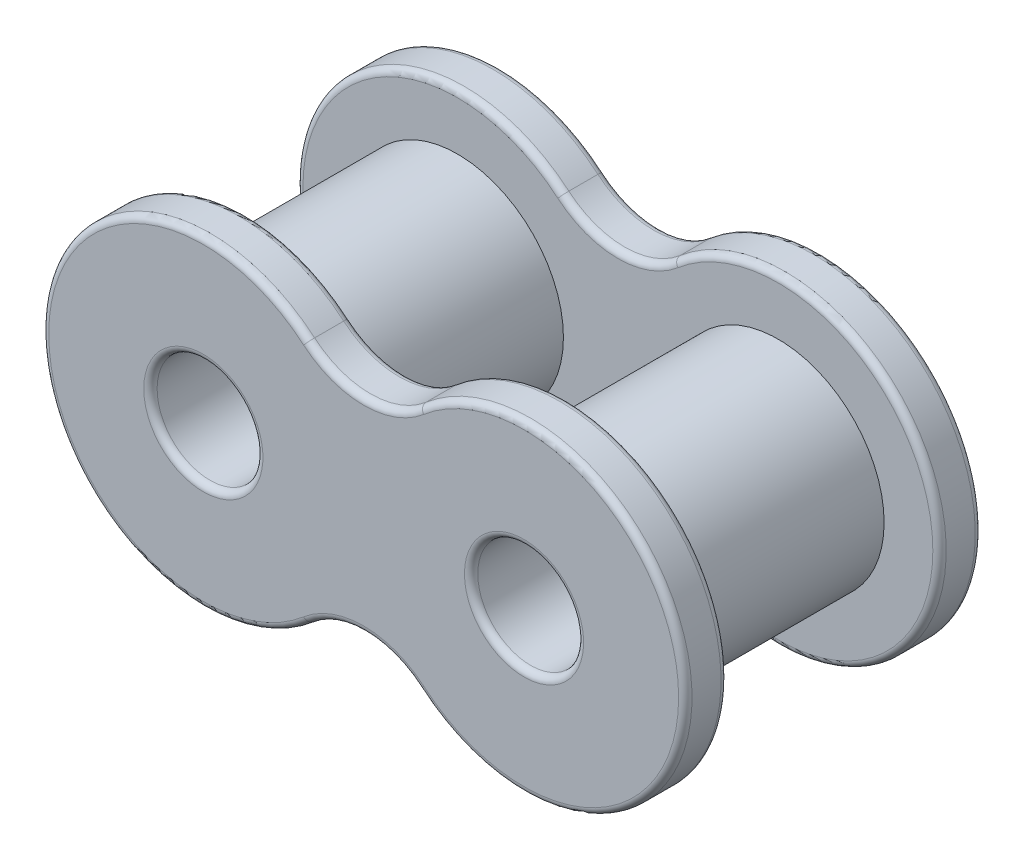
ISO-10303-21;
HEADER;
FILE_DESCRIPTION(('STEP AP214'),'2;1');
FILE_NAME('part.step','',(''),(''),'','','');
FILE_SCHEMA(('AUTOMOTIVE_DESIGN { 1 0 10303 214 1 1 1 1 }'));
ENDSEC;
DATA;
#1=APPLICATION_CONTEXT('core data for automotive mechanical design processes');
#2=APPLICATION_PROTOCOL_DEFINITION('international standard','automotive_design',2000,#1);
#3=PRODUCT_CONTEXT('',#1,'mechanical');
#4=PRODUCT('Part','Part','',(#3));
#5=PRODUCT_RELATED_PRODUCT_CATEGORY('part','',(#4));
#6=PRODUCT_DEFINITION_FORMATION('','',#4);
#7=PRODUCT_DEFINITION_CONTEXT('part definition',#1,'design');
#8=PRODUCT_DEFINITION('design','',#6,#7);
#9=PRODUCT_DEFINITION_SHAPE('','',#8);
#10=(LENGTH_UNIT() NAMED_UNIT(*) SI_UNIT(.MILLI.,.METRE.));
#11=(NAMED_UNIT(*) PLANE_ANGLE_UNIT() SI_UNIT($,.RADIAN.));
#12=(NAMED_UNIT(*) SI_UNIT($,.STERADIAN.) SOLID_ANGLE_UNIT());
#13=UNCERTAINTY_MEASURE_WITH_UNIT(LENGTH_MEASURE(1.E-05),#10,'distance_accuracy_value','');
#14=(GEOMETRIC_REPRESENTATION_CONTEXT(3) GLOBAL_UNCERTAINTY_ASSIGNED_CONTEXT((#13)) GLOBAL_UNIT_ASSIGNED_CONTEXT((#10,
#11,#12)) REPRESENTATION_CONTEXT('',''));
#15=CARTESIAN_POINT('',(0.,0.,0.));
#16=DIRECTION('',(0.,0.,1.));
#17=DIRECTION('',(1.,0.,0.));
#18=AXIS2_PLACEMENT_3D('',#15,#16,#17);
#19=CARTESIAN_POINT('',(3.,3.51943884074748,1.587));
#20=DIRECTION('',(0.,0.,1.));
#21=DIRECTION('',(1.,0.,0.));
#22=AXIS2_PLACEMENT_3D('',#19,#20,#21);
#23=PLANE('',#22);
#24=CARTESIAN_POINT('',(6.,0.,1.587));
#25=DIRECTION('',(0.,0.,1.));
#26=DIRECTION('',(1.,0.,0.));
#27=AXIS2_PLACEMENT_3D('',#24,#25,#26);
#28=CIRCLE('',#27,3.962);
#29=CARTESIAN_POINT('',(9.962,0.,1.587));
#30=VERTEX_POINT('',#29);
#31=EDGE_CURVE('E203',#30,#30,#28,.T.);
#32=ORIENTED_EDGE('',*,*,#31,.F.);
#33=EDGE_LOOP('',(#32));
#34=FACE_BOUND('',#33,.T.);
#35=CARTESIAN_POINT('',(6.,0.,1.587));
#36=DIRECTION('',(0.,0.,1.));
#37=DIRECTION('',(1.,0.,0.));
#38=AXIS2_PLACEMENT_3D('',#35,#36,#37);
#39=CIRCLE('',#38,5.785);
#40=CARTESIAN_POINT('',(2.2472012944139,-4.40258184198219,1.587));
#41=VERTEX_POINT('',#40);
#42=CARTESIAN_POINT('',(2.2472012944139,4.40258184198219,1.587));
#43=VERTEX_POINT('',#42);
#44=EDGE_CURVE('E173',#41,#43,#39,.T.);
#45=ORIENTED_EDGE('',*,*,#44,.T.);
#46=CARTESIAN_POINT('',(0.,7.03887768149496,1.587));
#47=DIRECTION('',(0.,0.,1.));
#48=DIRECTION('',(1.,0.,0.));
#49=AXIS2_PLACEMENT_3D('',#46,#47,#48);
#50=CIRCLE('',#49,3.4640972);
#51=CARTESIAN_POINT('',(-2.2472012944139,4.40258184198219,1.587));
#52=VERTEX_POINT('',#51);
#53=EDGE_CURVE('E153',#43,#52,#50,.F.);
#54=ORIENTED_EDGE('',*,*,#53,.T.);
#55=CARTESIAN_POINT('',(-6.,0.,1.587));
#56=DIRECTION('',(0.,0.,1.));
#57=DIRECTION('',(1.,0.,0.));
#58=AXIS2_PLACEMENT_3D('',#55,#56,#57);
#59=CIRCLE('',#58,5.785);
#60=CARTESIAN_POINT('',(-2.2472012944139,-4.40258184198219,1.587));
#61=VERTEX_POINT('',#60);
#62=EDGE_CURVE('E162',#52,#61,#59,.T.);
#63=ORIENTED_EDGE('',*,*,#62,.T.);
#64=CARTESIAN_POINT('',(0.,-7.03887768149496,1.587));
#65=DIRECTION('',(0.,0.,1.));
#66=DIRECTION('',(1.,0.,0.));
#67=AXIS2_PLACEMENT_3D('',#64,#65,#66);
#68=CIRCLE('',#67,3.4640972);
#69=EDGE_CURVE('E168',#61,#41,#68,.F.);
#70=ORIENTED_EDGE('',*,*,#69,.T.);
#71=EDGE_LOOP('',(#45,#54,#63,#70));
#72=FACE_BOUND('',#71,.T.);
#73=CARTESIAN_POINT('',(-6.,0.,1.587));
#74=DIRECTION('',(0.,0.,1.));
#75=DIRECTION('',(1.,0.,0.));
#76=AXIS2_PLACEMENT_3D('',#73,#74,#75);
#77=CIRCLE('',#76,3.962);
#78=CARTESIAN_POINT('',(-2.038,0.,1.587));
#79=VERTEX_POINT('',#78);
#80=EDGE_CURVE('E351',#79,#79,#77,.T.);
#81=ORIENTED_EDGE('',*,*,#80,.F.);
#82=EDGE_LOOP('',(#81));
#83=FACE_BOUND('',#82,.T.);
#84=ADVANCED_FACE('F35',(#34,#72,#83),#23,.T.);
#85=CARTESIAN_POINT('',(3.,3.51943884074748,0.));
#86=DIRECTION('',(0.,0.,1.));
#87=DIRECTION('',(1.,0.,0.));
#88=AXIS2_PLACEMENT_3D('',#85,#86,#87);
#89=PLANE('',#88);
#90=CARTESIAN_POINT('',(6.,0.,0.));
#91=DIRECTION('',(0.,0.,1.));
#92=DIRECTION('',(1.,0.,0.));
#93=AXIS2_PLACEMENT_3D('',#90,#91,#92);
#94=CIRCLE('',#93,2.23);
#95=CARTESIAN_POINT('',(8.23,0.,0.));
#96=VERTEX_POINT('',#95);
#97=EDGE_CURVE('E292',#96,#96,#94,.T.);
#98=ORIENTED_EDGE('',*,*,#97,.T.);
#99=EDGE_LOOP('',(#98));
#100=FACE_BOUND('',#99,.T.);
#101=CARTESIAN_POINT('',(-6.,0.,0.));
#102=DIRECTION('',(0.,0.,1.));
#103=DIRECTION('',(1.,0.,0.));
#104=AXIS2_PLACEMENT_3D('',#101,#102,#103);
#105=CIRCLE('',#104,2.23);
#106=CARTESIAN_POINT('',(-3.77,0.,0.));
#107=VERTEX_POINT('',#106);
#108=EDGE_CURVE('E289',#107,#107,#105,.T.);
#109=ORIENTED_EDGE('',*,*,#108,.T.);
#110=EDGE_LOOP('',(#109));
#111=FACE_BOUND('',#110,.T.);
#112=CARTESIAN_POINT('',(-6.,0.,0.));
#113=DIRECTION('',(0.,0.,1.));
#114=DIRECTION('',(1.,0.,0.));
#115=AXIS2_PLACEMENT_3D('',#112,#113,#114);
#116=CIRCLE('',#115,5.785);
#117=CARTESIAN_POINT('',(-2.2472012944139,-4.40258184198219,0.));
#118=VERTEX_POINT('',#117);
#119=CARTESIAN_POINT('',(-2.2472012944139,4.40258184198219,0.));
#120=VERTEX_POINT('',#119);
#121=EDGE_CURVE('E191',#118,#120,#116,.F.);
#122=ORIENTED_EDGE('',*,*,#121,.T.);
#123=CARTESIAN_POINT('',(0.,7.03887768149496,0.));
#124=DIRECTION('',(0.,0.,1.));
#125=DIRECTION('',(1.,0.,0.));
#126=AXIS2_PLACEMENT_3D('',#123,#124,#125);
#127=CIRCLE('',#126,3.4640972);
#128=CARTESIAN_POINT('',(2.2472012944139,4.40258184198219,0.));
#129=VERTEX_POINT('',#128);
#130=EDGE_CURVE('E197',#120,#129,#127,.T.);
#131=ORIENTED_EDGE('',*,*,#130,.T.);
#132=CARTESIAN_POINT('',(6.,0.,0.));
#133=DIRECTION('',(0.,0.,1.));
#134=DIRECTION('',(1.,0.,0.));
#135=AXIS2_PLACEMENT_3D('',#132,#133,#134);
#136=CIRCLE('',#135,5.785);
#137=CARTESIAN_POINT('',(2.2472012944139,-4.40258184198219,0.));
#138=VERTEX_POINT('',#137);
#139=EDGE_CURVE('E195',#129,#138,#136,.F.);
#140=ORIENTED_EDGE('',*,*,#139,.T.);
#141=CARTESIAN_POINT('',(0.,-7.03887768149496,0.));
#142=DIRECTION('',(0.,0.,1.));
#143=DIRECTION('',(1.,0.,0.));
#144=AXIS2_PLACEMENT_3D('',#141,#142,#143);
#145=CIRCLE('',#144,3.4640972);
#146=EDGE_CURVE('E193',#138,#118,#145,.T.);
#147=ORIENTED_EDGE('',*,*,#146,.T.);
#148=EDGE_LOOP('',(#122,#131,#140,#147));
#149=FACE_BOUND('',#148,.T.);
#150=ADVANCED_FACE('F304',(#100,#111,#149),#89,.F.);
#151=CARTESIAN_POINT('',(0.,7.03887768149496,1.587));
#152=DIRECTION('',(0.,0.,-1.));
#153=DIRECTION('',(-1.,0.,0.));
#154=AXIS2_PLACEMENT_3D('',#151,#152,#153);
#155=CYLINDRICAL_SURFACE('',#154,3.2140972);
#156=DIRECTION('',(0.,0.,-1.));
#157=VECTOR('',#156,1.);
#158=CARTESIAN_POINT('',(-2.08502330367984,4.59284034855013,1.587));
#159=LINE('',#158,#157);
#160=CARTESIAN_POINT('',(-2.08502330367984,4.59284034855013,1.337));
#161=VERTEX_POINT('',#160);
#162=CARTESIAN_POINT('',(-2.08502330367984,4.59284034855013,0.25));
#163=VERTEX_POINT('',#162);
#164=EDGE_CURVE('E169',#161,#163,#159,.T.);
#165=ORIENTED_EDGE('',*,*,#164,.F.);
#166=CARTESIAN_POINT('',(0.,7.03887768149496,1.337));
#167=DIRECTION('',(0.,0.,1.));
#168=DIRECTION('',(1.,0.,0.));
#169=AXIS2_PLACEMENT_3D('',#166,#167,#168);
#170=CIRCLE('',#169,3.2140972);
#171=CARTESIAN_POINT('',(2.08502330367985,4.59284034855014,1.337));
#172=VERTEX_POINT('',#171);
#173=EDGE_CURVE('E155',#161,#172,#170,.T.);
#174=ORIENTED_EDGE('',*,*,#173,.T.);
#175=DIRECTION('',(0.,0.,-1.));
#176=VECTOR('',#175,1.);
#177=CARTESIAN_POINT('',(2.08502330367985,4.59284034855014,1.587));
#178=LINE('',#177,#176);
#179=CARTESIAN_POINT('',(2.08502330367985,4.59284034855014,0.25));
#180=VERTEX_POINT('',#179);
#181=EDGE_CURVE('E210',#172,#180,#178,.T.);
#182=ORIENTED_EDGE('',*,*,#181,.T.);
#183=CARTESIAN_POINT('',(0.,7.03887768149496,0.25));
#184=DIRECTION('',(0.,0.,1.));
#185=DIRECTION('',(1.,0.,0.));
#186=AXIS2_PLACEMENT_3D('',#183,#184,#185);
#187=CIRCLE('',#186,3.2140972);
#188=EDGE_CURVE('E175',#180,#163,#187,.F.);
#189=ORIENTED_EDGE('',*,*,#188,.T.);
#190=EDGE_LOOP('',(#165,#174,#182,#189));
#191=FACE_BOUND('',#190,.T.);
#192=ADVANCED_FACE('F307',(#191),#155,.F.);
#193=CARTESIAN_POINT('',(-6.,0.,1.587));
#194=DIRECTION('',(0.,0.,-1.));
#195=DIRECTION('',(-1.,0.,0.));
#196=AXIS2_PLACEMENT_3D('',#193,#194,#195);
#197=CYLINDRICAL_SURFACE('',#196,6.035);
#198=DIRECTION('',(0.,0.,-1.));
#199=VECTOR('',#198,1.);
#200=CARTESIAN_POINT('',(-2.08502330367985,-4.59284034855014,1.587));
#201=LINE('',#200,#199);
#202=CARTESIAN_POINT('',(-2.08502330367985,-4.59284034855014,1.337));
#203=VERTEX_POINT('',#202);
#204=CARTESIAN_POINT('',(-2.08502330367985,-4.59284034855014,0.25));
#205=VERTEX_POINT('',#204);
#206=EDGE_CURVE('E332',#203,#205,#201,.T.);
#207=ORIENTED_EDGE('',*,*,#206,.F.);
#208=CARTESIAN_POINT('',(-6.,0.,1.337));
#209=DIRECTION('',(0.,0.,1.));
#210=DIRECTION('',(1.,0.,0.));
#211=AXIS2_PLACEMENT_3D('',#208,#209,#210);
#212=CIRCLE('',#211,6.035);
#213=EDGE_CURVE('E202',#203,#161,#212,.F.);
#214=ORIENTED_EDGE('',*,*,#213,.T.);
#215=ORIENTED_EDGE('',*,*,#164,.T.);
#216=CARTESIAN_POINT('',(-6.,0.,0.25));
#217=DIRECTION('',(0.,0.,1.));
#218=DIRECTION('',(1.,0.,0.));
#219=AXIS2_PLACEMENT_3D('',#216,#217,#218);
#220=CIRCLE('',#219,6.035);
#221=EDGE_CURVE('E200',#163,#205,#220,.T.);
#222=ORIENTED_EDGE('',*,*,#221,.T.);
#223=EDGE_LOOP('',(#207,#214,#215,#222));
#224=FACE_BOUND('',#223,.T.);
#225=ADVANCED_FACE('F331',(#224),#197,.T.);
#226=CARTESIAN_POINT('',(0.,-7.03887768149496,1.587));
#227=DIRECTION('',(0.,0.,-1.));
#228=DIRECTION('',(-1.,0.,0.));
#229=AXIS2_PLACEMENT_3D('',#226,#227,#228);
#230=CYLINDRICAL_SURFACE('',#229,3.2140972);
#231=DIRECTION('',(0.,0.,-1.));
#232=VECTOR('',#231,1.);
#233=CARTESIAN_POINT('',(2.08502330367985,-4.59284034855013,1.587));
#234=LINE('',#233,#232);
#235=CARTESIAN_POINT('',(2.08502330367985,-4.59284034855013,1.337));
#236=VERTEX_POINT('',#235);
#237=CARTESIAN_POINT('',(2.08502330367985,-4.59284034855013,0.25));
#238=VERTEX_POINT('',#237);
#239=EDGE_CURVE('E334',#236,#238,#234,.T.);
#240=ORIENTED_EDGE('',*,*,#239,.F.);
#241=CARTESIAN_POINT('',(0.,-7.03887768149496,1.337));
#242=DIRECTION('',(0.,0.,1.));
#243=DIRECTION('',(1.,0.,0.));
#244=AXIS2_PLACEMENT_3D('',#241,#242,#243);
#245=CIRCLE('',#244,3.2140972);
#246=EDGE_CURVE('E189',#236,#203,#245,.T.);
#247=ORIENTED_EDGE('',*,*,#246,.T.);
#248=ORIENTED_EDGE('',*,*,#206,.T.);
#249=CARTESIAN_POINT('',(0.,-7.03887768149496,0.25));
#250=DIRECTION('',(0.,0.,1.));
#251=DIRECTION('',(1.,0.,0.));
#252=AXIS2_PLACEMENT_3D('',#249,#250,#251);
#253=CIRCLE('',#252,3.2140972);
#254=EDGE_CURVE('E187',#205,#238,#253,.F.);
#255=ORIENTED_EDGE('',*,*,#254,.T.);
#256=EDGE_LOOP('',(#240,#247,#248,#255));
#257=FACE_BOUND('',#256,.T.);
#258=ADVANCED_FACE('F414',(#257),#230,.F.);
#259=CARTESIAN_POINT('',(6.,0.,1.587));
#260=DIRECTION('',(0.,0.,-1.));
#261=DIRECTION('',(-1.,0.,0.));
#262=AXIS2_PLACEMENT_3D('',#259,#260,#261);
#263=CYLINDRICAL_SURFACE('',#262,6.035);
#264=ORIENTED_EDGE('',*,*,#181,.F.);
#265=CARTESIAN_POINT('',(6.,0.,1.337));
#266=DIRECTION('',(0.,0.,1.));
#267=DIRECTION('',(1.,0.,0.));
#268=AXIS2_PLACEMENT_3D('',#265,#266,#267);
#269=CIRCLE('',#268,6.035);
#270=EDGE_CURVE('E185',#172,#236,#269,.F.);
#271=ORIENTED_EDGE('',*,*,#270,.T.);
#272=ORIENTED_EDGE('',*,*,#239,.T.);
#273=CARTESIAN_POINT('',(6.,0.,0.25));
#274=DIRECTION('',(0.,0.,1.));
#275=DIRECTION('',(1.,0.,0.));
#276=AXIS2_PLACEMENT_3D('',#273,#274,#275);
#277=CIRCLE('',#276,6.035);
#278=EDGE_CURVE('E183',#238,#180,#277,.T.);
#279=ORIENTED_EDGE('',*,*,#278,.T.);
#280=EDGE_LOOP('',(#264,#271,#272,#279));
#281=FACE_BOUND('',#280,.T.);
#282=ADVANCED_FACE('F347',(#281),#263,.T.);
#283=CARTESIAN_POINT('',(-6.,0.,1.587));
#284=DIRECTION('',(0.,0.,-1.));
#285=DIRECTION('',(-1.,0.,0.));
#286=AXIS2_PLACEMENT_3D('',#283,#284,#285);
#287=CYLINDRICAL_SURFACE('',#286,1.98);
#288=CARTESIAN_POINT('',(-6.,0.,10.8488));
#289=DIRECTION('',(0.,0.,-1.));
#290=DIRECTION('',(-1.,0.,0.));
#291=AXIS2_PLACEMENT_3D('',#288,#289,#290);
#292=CIRCLE('',#291,1.98);
#293=CARTESIAN_POINT('',(-7.98,0.,10.8488));
#294=VERTEX_POINT('',#293);
#295=EDGE_CURVE('E11',#294,#294,#292,.F.);
#296=ORIENTED_EDGE('',*,*,#295,.T.);
#297=EDGE_LOOP('',(#296));
#298=FACE_BOUND('',#297,.T.);
#299=CARTESIAN_POINT('',(-6.,0.,0.25));
#300=DIRECTION('',(0.,0.,1.));
#301=DIRECTION('',(1.,0.,0.));
#302=AXIS2_PLACEMENT_3D('',#299,#300,#301);
#303=CIRCLE('',#302,1.98);
#304=CARTESIAN_POINT('',(-4.02,0.,0.25));
#305=VERTEX_POINT('',#304);
#306=EDGE_CURVE('E43',#305,#305,#303,.F.);
#307=ORIENTED_EDGE('',*,*,#306,.T.);
#308=EDGE_LOOP('',(#307));
#309=FACE_BOUND('',#308,.T.);
#310=ADVANCED_FACE('F297',(#298,#309),#287,.F.);
#311=CARTESIAN_POINT('',(6.,0.,1.587));
#312=DIRECTION('',(0.,0.,-1.));
#313=DIRECTION('',(-1.,0.,0.));
#314=AXIS2_PLACEMENT_3D('',#311,#312,#313);
#315=CYLINDRICAL_SURFACE('',#314,1.98);
#316=CARTESIAN_POINT('',(6.,0.,10.8488));
#317=DIRECTION('',(0.,0.,-1.));
#318=DIRECTION('',(-1.,0.,0.));
#319=AXIS2_PLACEMENT_3D('',#316,#317,#318);
#320=CIRCLE('',#319,1.98);
#321=CARTESIAN_POINT('',(4.02,0.,10.8488));
#322=VERTEX_POINT('',#321);
#323=EDGE_CURVE('E280',#322,#322,#320,.F.);
#324=ORIENTED_EDGE('',*,*,#323,.T.);
#325=EDGE_LOOP('',(#324));
#326=FACE_BOUND('',#325,.T.);
#327=CARTESIAN_POINT('',(6.,0.,0.25));
#328=DIRECTION('',(0.,0.,1.));
#329=DIRECTION('',(1.,0.,0.));
#330=AXIS2_PLACEMENT_3D('',#327,#328,#329);
#331=CIRCLE('',#330,1.98);
#332=CARTESIAN_POINT('',(7.98,0.,0.25));
#333=VERTEX_POINT('',#332);
#334=EDGE_CURVE('E256',#333,#333,#331,.F.);
#335=ORIENTED_EDGE('',*,*,#334,.T.);
#336=EDGE_LOOP('',(#335));
#337=FACE_BOUND('',#336,.T.);
#338=ADVANCED_FACE('F431',(#326,#337),#315,.F.);
#339=CARTESIAN_POINT('',(0.,-7.03887768149496,1.337));
#340=DIRECTION('',(0.,0.,1.));
#341=DIRECTION('',(1.,0.,0.));
#342=AXIS2_PLACEMENT_3D('',#339,#340,#341);
#343=TOROIDAL_SURFACE('',#342,3.4640972,0.25);
#344=CARTESIAN_POINT('',(-2.2472012944139,-4.40258184198219,1.337));
#345=DIRECTION('',(-0.76103402627177,-0.648711962936232,0.));
#346=DIRECTION('',(0.648711962936232,-0.76103402627177,0.));
#347=AXIS2_PLACEMENT_3D('',#344,#345,#346);
#348=CIRCLE('',#347,0.25);
#349=EDGE_CURVE('E165',#203,#61,#348,.T.);
#350=ORIENTED_EDGE('',*,*,#349,.F.);
#351=ORIENTED_EDGE('',*,*,#246,.F.);
#352=CARTESIAN_POINT('',(2.2472012944139,-4.40258184198219,1.337));
#353=DIRECTION('',(0.76103402627177,-0.648711962936232,0.));
#354=DIRECTION('',(0.648711962936232,0.76103402627177,0.));
#355=AXIS2_PLACEMENT_3D('',#352,#353,#354);
#356=CIRCLE('',#355,0.25);
#357=EDGE_CURVE('E207',#41,#236,#356,.T.);
#358=ORIENTED_EDGE('',*,*,#357,.F.);
#359=ORIENTED_EDGE('',*,*,#69,.F.);
#360=EDGE_LOOP('',(#350,#351,#358,#359));
#361=FACE_BOUND('',#360,.T.);
#362=ADVANCED_FACE('F340',(#361),#343,.T.);
#363=CARTESIAN_POINT('',(6.,0.,1.337));
#364=DIRECTION('',(0.,0.,1.));
#365=DIRECTION('',(1.,0.,0.));
#366=AXIS2_PLACEMENT_3D('',#363,#364,#365);
#367=TOROIDAL_SURFACE('',#366,5.785,0.25);
#368=ORIENTED_EDGE('',*,*,#357,.T.);
#369=ORIENTED_EDGE('',*,*,#270,.F.);
#370=CARTESIAN_POINT('',(2.2472012944139,4.40258184198219,1.337));
#371=DIRECTION('',(-0.76103402627177,-0.648711962936232,0.));
#372=DIRECTION('',(0.648711962936232,-0.76103402627177,0.));
#373=AXIS2_PLACEMENT_3D('',#370,#371,#372);
#374=CIRCLE('',#373,0.25);
#375=EDGE_CURVE('E158',#43,#172,#374,.T.);
#376=ORIENTED_EDGE('',*,*,#375,.F.);
#377=ORIENTED_EDGE('',*,*,#44,.F.);
#378=EDGE_LOOP('',(#368,#369,#376,#377));
#379=FACE_BOUND('',#378,.T.);
#380=ADVANCED_FACE('F343',(#379),#367,.T.);
#381=CARTESIAN_POINT('',(-6.,0.,1.337));
#382=DIRECTION('',(0.,0.,1.));
#383=DIRECTION('',(1.,0.,0.));
#384=AXIS2_PLACEMENT_3D('',#381,#382,#383);
#385=TOROIDAL_SURFACE('',#384,5.785,0.25);
#386=ORIENTED_EDGE('',*,*,#349,.T.);
#387=ORIENTED_EDGE('',*,*,#62,.F.);
#388=CARTESIAN_POINT('',(-2.2472012944139,4.40258184198219,1.337));
#389=DIRECTION('',(0.761034026271771,-0.648711962936231,0.));
#390=DIRECTION('',(0.648711962936231,0.761034026271771,0.));
#391=AXIS2_PLACEMENT_3D('',#388,#389,#390);
#392=CIRCLE('',#391,0.25);
#393=EDGE_CURVE('E149',#161,#52,#392,.T.);
#394=ORIENTED_EDGE('',*,*,#393,.F.);
#395=ORIENTED_EDGE('',*,*,#213,.F.);
#396=EDGE_LOOP('',(#386,#387,#394,#395));
#397=FACE_BOUND('',#396,.T.);
#398=ADVANCED_FACE('F163',(#397),#385,.T.);
#399=CARTESIAN_POINT('',(0.,7.03887768149496,1.337));
#400=DIRECTION('',(0.,0.,1.));
#401=DIRECTION('',(1.,0.,0.));
#402=AXIS2_PLACEMENT_3D('',#399,#400,#401);
#403=TOROIDAL_SURFACE('',#402,3.4640972,0.25);
#404=ORIENTED_EDGE('',*,*,#375,.T.);
#405=ORIENTED_EDGE('',*,*,#173,.F.);
#406=ORIENTED_EDGE('',*,*,#393,.T.);
#407=ORIENTED_EDGE('',*,*,#53,.F.);
#408=EDGE_LOOP('',(#404,#405,#406,#407));
#409=FACE_BOUND('',#408,.T.);
#410=ADVANCED_FACE('F151',(#409),#403,.T.);
#411=CARTESIAN_POINT('',(0.,-7.03887768149496,0.25));
#412=DIRECTION('',(0.,0.,1.));
#413=DIRECTION('',(1.,0.,0.));
#414=AXIS2_PLACEMENT_3D('',#411,#412,#413);
#415=TOROIDAL_SURFACE('',#414,3.4640972,0.25);
#416=CARTESIAN_POINT('',(-2.2472012944139,-4.40258184198219,0.25));
#417=DIRECTION('',(-0.761034026271769,-0.648711962936233,0.));
#418=DIRECTION('',(0.648711962936233,-0.761034026271769,0.));
#419=AXIS2_PLACEMENT_3D('',#416,#417,#418);
#420=CIRCLE('',#419,0.25);
#421=EDGE_CURVE('E216',#118,#205,#420,.T.);
#422=ORIENTED_EDGE('',*,*,#421,.F.);
#423=ORIENTED_EDGE('',*,*,#146,.F.);
#424=CARTESIAN_POINT('',(2.2472012944139,-4.40258184198219,0.25));
#425=DIRECTION('',(0.761034026271771,-0.648711962936231,0.));
#426=DIRECTION('',(0.648711962936231,0.761034026271771,0.));
#427=AXIS2_PLACEMENT_3D('',#424,#425,#426);
#428=CIRCLE('',#427,0.25);
#429=EDGE_CURVE('E159',#238,#138,#428,.T.);
#430=ORIENTED_EDGE('',*,*,#429,.F.);
#431=ORIENTED_EDGE('',*,*,#254,.F.);
#432=EDGE_LOOP('',(#422,#423,#430,#431));
#433=FACE_BOUND('',#432,.T.);
#434=ADVANCED_FACE('F424',(#433),#415,.T.);
#435=CARTESIAN_POINT('',(6.,0.,0.25));
#436=DIRECTION('',(0.,0.,1.));
#437=DIRECTION('',(1.,0.,0.));
#438=AXIS2_PLACEMENT_3D('',#435,#436,#437);
#439=TOROIDAL_SURFACE('',#438,5.785,0.25);
#440=ORIENTED_EDGE('',*,*,#429,.T.);
#441=ORIENTED_EDGE('',*,*,#139,.F.);
#442=CARTESIAN_POINT('',(2.2472012944139,4.40258184198219,0.25));
#443=DIRECTION('',(-0.761034026271771,-0.648711962936231,0.));
#444=DIRECTION('',(0.648711962936231,-0.761034026271771,0.));
#445=AXIS2_PLACEMENT_3D('',#442,#443,#444);
#446=CIRCLE('',#445,0.25);
#447=EDGE_CURVE('E213',#180,#129,#446,.T.);
#448=ORIENTED_EDGE('',*,*,#447,.F.);
#449=ORIENTED_EDGE('',*,*,#278,.F.);
#450=EDGE_LOOP('',(#440,#441,#448,#449));
#451=FACE_BOUND('',#450,.T.);
#452=ADVANCED_FACE('F437',(#451),#439,.T.);
#453=CARTESIAN_POINT('',(-6.,0.,0.25));
#454=DIRECTION('',(0.,0.,1.));
#455=DIRECTION('',(1.,0.,0.));
#456=AXIS2_PLACEMENT_3D('',#453,#454,#455);
#457=TOROIDAL_SURFACE('',#456,5.785,0.25);
#458=ORIENTED_EDGE('',*,*,#421,.T.);
#459=ORIENTED_EDGE('',*,*,#221,.F.);
#460=CARTESIAN_POINT('',(-2.2472012944139,4.40258184198219,0.25));
#461=DIRECTION('',(0.761034026271771,-0.648711962936231,0.));
#462=DIRECTION('',(0.648711962936231,0.761034026271771,0.));
#463=AXIS2_PLACEMENT_3D('',#460,#461,#462);
#464=CIRCLE('',#463,0.25);
#465=EDGE_CURVE('E211',#120,#163,#464,.T.);
#466=ORIENTED_EDGE('',*,*,#465,.F.);
#467=ORIENTED_EDGE('',*,*,#121,.F.);
#468=EDGE_LOOP('',(#458,#459,#466,#467));
#469=FACE_BOUND('',#468,.T.);
#470=ADVANCED_FACE('F322',(#469),#457,.T.);
#471=CARTESIAN_POINT('',(0.,7.03887768149496,0.25));
#472=DIRECTION('',(0.,0.,1.));
#473=DIRECTION('',(1.,0.,0.));
#474=AXIS2_PLACEMENT_3D('',#471,#472,#473);
#475=TOROIDAL_SURFACE('',#474,3.4640972,0.25);
#476=ORIENTED_EDGE('',*,*,#447,.T.);
#477=ORIENTED_EDGE('',*,*,#130,.F.);
#478=ORIENTED_EDGE('',*,*,#465,.T.);
#479=ORIENTED_EDGE('',*,*,#188,.F.);
#480=EDGE_LOOP('',(#476,#477,#478,#479));
#481=FACE_BOUND('',#480,.T.);
#482=ADVANCED_FACE('F317',(#481),#475,.T.);
#483=CARTESIAN_POINT('',(-6.,0.,9.5118));
#484=DIRECTION('',(0.,0.,-1.));
#485=DIRECTION('',(-1.,0.,0.));
#486=AXIS2_PLACEMENT_3D('',#483,#484,#485);
#487=CYLINDRICAL_SURFACE('',#486,3.962);
#488=CARTESIAN_POINT('',(-6.,0.,9.5118));
#489=DIRECTION('',(0.,0.,1.));
#490=DIRECTION('',(1.,0.,0.));
#491=AXIS2_PLACEMENT_3D('',#488,#489,#490);
#492=CIRCLE('',#491,3.962);
#493=CARTESIAN_POINT('',(-2.038,0.,9.5118));
#494=VERTEX_POINT('',#493);
#495=EDGE_CURVE('E214',#494,#494,#492,.T.);
#496=ORIENTED_EDGE('',*,*,#495,.F.);
#497=EDGE_LOOP('',(#496));
#498=FACE_BOUND('',#497,.T.);
#499=ORIENTED_EDGE('',*,*,#80,.T.);
#500=EDGE_LOOP('',(#499));
#501=FACE_BOUND('',#500,.T.);
#502=ADVANCED_FACE('F434',(#498,#501),#487,.T.);
#503=CARTESIAN_POINT('',(6.,0.,9.5118));
#504=DIRECTION('',(0.,0.,-1.));
#505=DIRECTION('',(-1.,0.,0.));
#506=AXIS2_PLACEMENT_3D('',#503,#504,#505);
#507=CYLINDRICAL_SURFACE('',#506,3.962);
#508=CARTESIAN_POINT('',(6.,0.,9.5118));
#509=DIRECTION('',(0.,0.,-1.));
#510=DIRECTION('',(-1.,0.,0.));
#511=AXIS2_PLACEMENT_3D('',#508,#509,#510);
#512=CIRCLE('',#511,3.962);
#513=CARTESIAN_POINT('',(2.038,0.,9.5118));
#514=VERTEX_POINT('',#513);
#515=EDGE_CURVE('E354',#514,#514,#512,.T.);
#516=ORIENTED_EDGE('',*,*,#515,.T.);
#517=EDGE_LOOP('',(#516));
#518=FACE_BOUND('',#517,.T.);
#519=ORIENTED_EDGE('',*,*,#31,.T.);
#520=EDGE_LOOP('',(#519));
#521=FACE_BOUND('',#520,.T.);
#522=ADVANCED_FACE('F493',(#518,#521),#507,.T.);
#523=CARTESIAN_POINT('',(3.,3.51943884074748,9.5118));
#524=DIRECTION('',(0.,0.,-1.));
#525=DIRECTION('',(1.,0.,0.));
#526=AXIS2_PLACEMENT_3D('',#523,#524,#525);
#527=PLANE('',#526);
#528=CARTESIAN_POINT('',(-6.,0.,9.5118));
#529=DIRECTION('',(0.,0.,-1.));
#530=DIRECTION('',(-1.,0.,0.));
#531=AXIS2_PLACEMENT_3D('',#528,#529,#530);
#532=CIRCLE('',#531,5.785);
#533=CARTESIAN_POINT('',(-2.2472012944139,-4.40258184198219,9.5118));
#534=VERTEX_POINT('',#533);
#535=CARTESIAN_POINT('',(-2.2472012944139,4.40258184198219,9.5118));
#536=VERTEX_POINT('',#535);
#537=EDGE_CURVE('E229',#534,#536,#532,.T.);
#538=ORIENTED_EDGE('',*,*,#537,.T.);
#539=CARTESIAN_POINT('',(0.,7.03887768149496,9.5118));
#540=DIRECTION('',(0.,0.,-1.));
#541=DIRECTION('',(-1.,0.,0.));
#542=AXIS2_PLACEMENT_3D('',#539,#540,#541);
#543=CIRCLE('',#542,3.4640972);
#544=CARTESIAN_POINT('',(2.2472012944139,4.40258184198219,9.5118));
#545=VERTEX_POINT('',#544);
#546=EDGE_CURVE('E235',#536,#545,#543,.F.);
#547=ORIENTED_EDGE('',*,*,#546,.T.);
#548=CARTESIAN_POINT('',(6.,0.,9.5118));
#549=DIRECTION('',(0.,0.,-1.));
#550=DIRECTION('',(-1.,0.,0.));
#551=AXIS2_PLACEMENT_3D('',#548,#549,#550);
#552=CIRCLE('',#551,5.785);
#553=CARTESIAN_POINT('',(2.2472012944139,-4.40258184198219,9.5118));
#554=VERTEX_POINT('',#553);
#555=EDGE_CURVE('E233',#545,#554,#552,.T.);
#556=ORIENTED_EDGE('',*,*,#555,.T.);
#557=CARTESIAN_POINT('',(0.,-7.03887768149496,9.5118));
#558=DIRECTION('',(0.,0.,-1.));
#559=DIRECTION('',(-1.,0.,0.));
#560=AXIS2_PLACEMENT_3D('',#557,#558,#559);
#561=CIRCLE('',#560,3.4640972);
#562=EDGE_CURVE('E231',#554,#534,#561,.F.);
#563=ORIENTED_EDGE('',*,*,#562,.T.);
#564=EDGE_LOOP('',(#538,#547,#556,#563));
#565=FACE_BOUND('',#564,.T.);
#566=ORIENTED_EDGE('',*,*,#515,.F.);
#567=EDGE_LOOP('',(#566));
#568=FACE_BOUND('',#567,.T.);
#569=ORIENTED_EDGE('',*,*,#495,.T.);
#570=EDGE_LOOP('',(#569));
#571=FACE_BOUND('',#570,.T.);
#572=ADVANCED_FACE('F497',(#565,#568,#571),#527,.T.);
#573=CARTESIAN_POINT('',(0.,7.03887768149496,9.5118));
#574=DIRECTION('',(0.,0.,1.));
#575=DIRECTION('',(1.,0.,0.));
#576=AXIS2_PLACEMENT_3D('',#573,#574,#575);
#577=CYLINDRICAL_SURFACE('',#576,3.2140972);
#578=DIRECTION('',(0.,0.,1.));
#579=VECTOR('',#578,1.);
#580=CARTESIAN_POINT('',(2.08502330367985,4.59284034855014,9.5118));
#581=LINE('',#580,#579);
#582=CARTESIAN_POINT('',(2.08502330367985,4.59284034855014,9.7618));
#583=VERTEX_POINT('',#582);
#584=CARTESIAN_POINT('',(2.08502330367985,4.59284034855014,10.8488));
#585=VERTEX_POINT('',#584);
#586=EDGE_CURVE('E359',#583,#585,#581,.T.);
#587=ORIENTED_EDGE('',*,*,#586,.F.);
#588=CARTESIAN_POINT('',(0.,7.03887768149496,9.7618));
#589=DIRECTION('',(0.,0.,-1.));
#590=DIRECTION('',(-1.,0.,0.));
#591=AXIS2_PLACEMENT_3D('',#588,#589,#590);
#592=CIRCLE('',#591,3.2140972);
#593=CARTESIAN_POINT('',(-2.08502330367984,4.59284034855013,9.7618));
#594=VERTEX_POINT('',#593);
#595=EDGE_CURVE('E226',#583,#594,#592,.T.);
#596=ORIENTED_EDGE('',*,*,#595,.T.);
#597=DIRECTION('',(0.,0.,1.));
#598=VECTOR('',#597,1.);
#599=CARTESIAN_POINT('',(-2.08502330367984,4.59284034855013,9.5118));
#600=LINE('',#599,#598);
#601=CARTESIAN_POINT('',(-2.08502330367984,4.59284034855013,10.8488));
#602=VERTEX_POINT('',#601);
#603=EDGE_CURVE('E268',#594,#602,#600,.T.);
#604=ORIENTED_EDGE('',*,*,#603,.T.);
#605=CARTESIAN_POINT('',(0.,7.03887768149496,10.8488));
#606=DIRECTION('',(0.,0.,-1.));
#607=DIRECTION('',(-1.,0.,0.));
#608=AXIS2_PLACEMENT_3D('',#605,#606,#607);
#609=CIRCLE('',#608,3.2140972);
#610=EDGE_CURVE('E223',#602,#585,#609,.F.);
#611=ORIENTED_EDGE('',*,*,#610,.T.);
#612=EDGE_LOOP('',(#587,#596,#604,#611));
#613=FACE_BOUND('',#612,.T.);
#614=ADVANCED_FACE('F373',(#613),#577,.F.);
#615=CARTESIAN_POINT('',(6.,0.,9.5118));
#616=DIRECTION('',(0.,0.,1.));
#617=DIRECTION('',(1.,0.,0.));
#618=AXIS2_PLACEMENT_3D('',#615,#616,#617);
#619=CYLINDRICAL_SURFACE('',#618,6.035);
#620=DIRECTION('',(0.,0.,1.));
#621=VECTOR('',#620,1.);
#622=CARTESIAN_POINT('',(2.08502330367985,-4.59284034855013,9.5118));
#623=LINE('',#622,#621);
#624=CARTESIAN_POINT('',(2.08502330367985,-4.59284034855013,9.7618));
#625=VERTEX_POINT('',#624);
#626=CARTESIAN_POINT('',(2.08502330367985,-4.59284034855013,10.8488));
#627=VERTEX_POINT('',#626);
#628=EDGE_CURVE('E362',#625,#627,#623,.T.);
#629=ORIENTED_EDGE('',*,*,#628,.F.);
#630=CARTESIAN_POINT('',(6.,0.,9.7618));
#631=DIRECTION('',(0.,0.,-1.));
#632=DIRECTION('',(-1.,0.,0.));
#633=AXIS2_PLACEMENT_3D('',#630,#631,#632);
#634=CIRCLE('',#633,6.035);
#635=EDGE_CURVE('E240',#625,#583,#634,.F.);
#636=ORIENTED_EDGE('',*,*,#635,.T.);
#637=ORIENTED_EDGE('',*,*,#586,.T.);
#638=CARTESIAN_POINT('',(6.,0.,10.8488));
#639=DIRECTION('',(0.,0.,-1.));
#640=DIRECTION('',(-1.,0.,0.));
#641=AXIS2_PLACEMENT_3D('',#638,#639,#640);
#642=CIRCLE('',#641,6.035);
#643=EDGE_CURVE('E238',#585,#627,#642,.T.);
#644=ORIENTED_EDGE('',*,*,#643,.T.);
#645=EDGE_LOOP('',(#629,#636,#637,#644));
#646=FACE_BOUND('',#645,.T.);
#647=ADVANCED_FACE('F501',(#646),#619,.T.);
#648=CARTESIAN_POINT('',(0.,-7.03887768149496,9.5118));
#649=DIRECTION('',(0.,0.,1.));
#650=DIRECTION('',(1.,0.,0.));
#651=AXIS2_PLACEMENT_3D('',#648,#649,#650);
#652=CYLINDRICAL_SURFACE('',#651,3.2140972);
#653=DIRECTION('',(0.,0.,1.));
#654=VECTOR('',#653,1.);
#655=CARTESIAN_POINT('',(-2.08502330367985,-4.59284034855014,9.5118));
#656=LINE('',#655,#654);
#657=CARTESIAN_POINT('',(-2.08502330367985,-4.59284034855014,9.7618));
#658=VERTEX_POINT('',#657);
#659=CARTESIAN_POINT('',(-2.08502330367985,-4.59284034855014,10.8488));
#660=VERTEX_POINT('',#659);
#661=EDGE_CURVE('E365',#658,#660,#656,.T.);
#662=ORIENTED_EDGE('',*,*,#661,.F.);
#663=CARTESIAN_POINT('',(0.,-7.03887768149496,9.7618));
#664=DIRECTION('',(0.,0.,-1.));
#665=DIRECTION('',(-1.,0.,0.));
#666=AXIS2_PLACEMENT_3D('',#663,#664,#665);
#667=CIRCLE('',#666,3.2140972);
#668=EDGE_CURVE('E244',#658,#625,#667,.T.);
#669=ORIENTED_EDGE('',*,*,#668,.T.);
#670=ORIENTED_EDGE('',*,*,#628,.T.);
#671=CARTESIAN_POINT('',(0.,-7.03887768149496,10.8488));
#672=DIRECTION('',(0.,0.,-1.));
#673=DIRECTION('',(-1.,0.,0.));
#674=AXIS2_PLACEMENT_3D('',#671,#672,#673);
#675=CIRCLE('',#674,3.2140972);
#676=EDGE_CURVE('E242',#627,#660,#675,.F.);
#677=ORIENTED_EDGE('',*,*,#676,.T.);
#678=EDGE_LOOP('',(#662,#669,#670,#677));
#679=FACE_BOUND('',#678,.T.);
#680=ADVANCED_FACE('F399',(#679),#652,.F.);
#681=CARTESIAN_POINT('',(-6.,0.,9.5118));
#682=DIRECTION('',(0.,0.,1.));
#683=DIRECTION('',(1.,0.,0.));
#684=AXIS2_PLACEMENT_3D('',#681,#682,#683);
#685=CYLINDRICAL_SURFACE('',#684,6.035);
#686=ORIENTED_EDGE('',*,*,#603,.F.);
#687=CARTESIAN_POINT('',(-6.,0.,9.7618));
#688=DIRECTION('',(0.,0.,-1.));
#689=DIRECTION('',(-1.,0.,0.));
#690=AXIS2_PLACEMENT_3D('',#687,#688,#689);
#691=CIRCLE('',#690,6.035);
#692=EDGE_CURVE('E254',#594,#658,#691,.F.);
#693=ORIENTED_EDGE('',*,*,#692,.T.);
#694=ORIENTED_EDGE('',*,*,#661,.T.);
#695=CARTESIAN_POINT('',(-6.,0.,10.8488));
#696=DIRECTION('',(0.,0.,-1.));
#697=DIRECTION('',(-1.,0.,0.));
#698=AXIS2_PLACEMENT_3D('',#695,#696,#697);
#699=CIRCLE('',#698,6.035);
#700=EDGE_CURVE('E252',#660,#602,#699,.T.);
#701=ORIENTED_EDGE('',*,*,#700,.T.);
#702=EDGE_LOOP('',(#686,#693,#694,#701));
#703=FACE_BOUND('',#702,.T.);
#704=ADVANCED_FACE('F389',(#703),#685,.T.);
#705=CARTESIAN_POINT('',(3.,3.51943884074748,11.0988));
#706=DIRECTION('',(0.,0.,-1.));
#707=DIRECTION('',(1.,0.,0.));
#708=AXIS2_PLACEMENT_3D('',#705,#706,#707);
#709=PLANE('',#708);
#710=CARTESIAN_POINT('',(6.,0.,11.0988));
#711=DIRECTION('',(0.,0.,-1.));
#712=DIRECTION('',(-1.,0.,0.));
#713=AXIS2_PLACEMENT_3D('',#710,#711,#712);
#714=CIRCLE('',#713,2.23);
#715=CARTESIAN_POINT('',(3.77,0.,11.0988));
#716=VERTEX_POINT('',#715);
#717=EDGE_CURVE('E286',#716,#716,#714,.T.);
#718=ORIENTED_EDGE('',*,*,#717,.T.);
#719=EDGE_LOOP('',(#718));
#720=FACE_BOUND('',#719,.T.);
#721=CARTESIAN_POINT('',(-6.,0.,11.0988));
#722=DIRECTION('',(0.,0.,-1.));
#723=DIRECTION('',(-1.,0.,0.));
#724=AXIS2_PLACEMENT_3D('',#721,#722,#723);
#725=CIRCLE('',#724,2.23);
#726=CARTESIAN_POINT('',(-8.23,0.,11.0988));
#727=VERTEX_POINT('',#726);
#728=EDGE_CURVE('E283',#727,#727,#725,.T.);
#729=ORIENTED_EDGE('',*,*,#728,.T.);
#730=EDGE_LOOP('',(#729));
#731=FACE_BOUND('',#730,.T.);
#732=CARTESIAN_POINT('',(6.,0.,11.0988));
#733=DIRECTION('',(0.,0.,-1.));
#734=DIRECTION('',(-1.,0.,0.));
#735=AXIS2_PLACEMENT_3D('',#732,#733,#734);
#736=CIRCLE('',#735,5.785);
#737=CARTESIAN_POINT('',(2.2472012944139,-4.40258184198219,11.0988));
#738=VERTEX_POINT('',#737);
#739=CARTESIAN_POINT('',(2.2472012944139,4.40258184198219,11.0988));
#740=VERTEX_POINT('',#739);
#741=EDGE_CURVE('E50',#738,#740,#736,.F.);
#742=ORIENTED_EDGE('',*,*,#741,.T.);
#743=CARTESIAN_POINT('',(0.,7.03887768149496,11.0988));
#744=DIRECTION('',(0.,0.,-1.));
#745=DIRECTION('',(-1.,0.,0.));
#746=AXIS2_PLACEMENT_3D('',#743,#744,#745);
#747=CIRCLE('',#746,3.4640972);
#748=CARTESIAN_POINT('',(-2.2472012944139,4.40258184198219,11.0988));
#749=VERTEX_POINT('',#748);
#750=EDGE_CURVE('E250',#740,#749,#747,.T.);
#751=ORIENTED_EDGE('',*,*,#750,.T.);
#752=CARTESIAN_POINT('',(-6.,0.,11.0988));
#753=DIRECTION('',(0.,0.,-1.));
#754=DIRECTION('',(-1.,0.,0.));
#755=AXIS2_PLACEMENT_3D('',#752,#753,#754);
#756=CIRCLE('',#755,5.785);
#757=CARTESIAN_POINT('',(-2.2472012944139,-4.40258184198219,11.0988));
#758=VERTEX_POINT('',#757);
#759=EDGE_CURVE('E246',#749,#758,#756,.F.);
#760=ORIENTED_EDGE('',*,*,#759,.T.);
#761=CARTESIAN_POINT('',(0.,-7.03887768149496,11.0988));
#762=DIRECTION('',(0.,0.,-1.));
#763=DIRECTION('',(-1.,0.,0.));
#764=AXIS2_PLACEMENT_3D('',#761,#762,#763);
#765=CIRCLE('',#764,3.4640972);
#766=EDGE_CURVE('E55',#758,#738,#765,.T.);
#767=ORIENTED_EDGE('',*,*,#766,.T.);
#768=EDGE_LOOP('',(#742,#751,#760,#767));
#769=FACE_BOUND('',#768,.T.);
#770=ADVANCED_FACE('F386',(#720,#731,#769),#709,.F.);
#771=CARTESIAN_POINT('',(0.,-7.03887768149496,9.7618));
#772=DIRECTION('',(0.,0.,-1.));
#773=DIRECTION('',(-1.,0.,0.));
#774=AXIS2_PLACEMENT_3D('',#771,#772,#773);
#775=TOROIDAL_SURFACE('',#774,3.4640972,0.25);
#776=CARTESIAN_POINT('',(-2.2472012944139,-4.40258184198219,9.7618));
#777=DIRECTION('',(-0.761034026271769,-0.648711962936233,0.));
#778=DIRECTION('',(0.648711962936233,-0.761034026271769,0.));
#779=AXIS2_PLACEMENT_3D('',#776,#777,#778);
#780=CIRCLE('',#779,0.25);
#781=EDGE_CURVE('E262',#534,#658,#780,.T.);
#782=ORIENTED_EDGE('',*,*,#781,.F.);
#783=ORIENTED_EDGE('',*,*,#562,.F.);
#784=CARTESIAN_POINT('',(2.2472012944139,-4.40258184198219,9.7618));
#785=DIRECTION('',(0.761034026271771,-0.648711962936231,0.));
#786=DIRECTION('',(0.648711962936231,0.761034026271771,0.));
#787=AXIS2_PLACEMENT_3D('',#784,#785,#786);
#788=CIRCLE('',#787,0.25);
#789=EDGE_CURVE('E265',#625,#554,#788,.T.);
#790=ORIENTED_EDGE('',*,*,#789,.F.);
#791=ORIENTED_EDGE('',*,*,#668,.F.);
#792=EDGE_LOOP('',(#782,#783,#790,#791));
#793=FACE_BOUND('',#792,.T.);
#794=ADVANCED_FACE('F388',(#793),#775,.T.);
#795=CARTESIAN_POINT('',(6.,0.,9.7618));
#796=DIRECTION('',(0.,0.,-1.));
#797=DIRECTION('',(-1.,0.,0.));
#798=AXIS2_PLACEMENT_3D('',#795,#796,#797);
#799=TOROIDAL_SURFACE('',#798,5.785,0.25);
#800=ORIENTED_EDGE('',*,*,#789,.T.);
#801=ORIENTED_EDGE('',*,*,#555,.F.);
#802=CARTESIAN_POINT('',(2.2472012944139,4.40258184198219,9.7618));
#803=DIRECTION('',(-0.761034026271771,-0.648711962936231,0.));
#804=DIRECTION('',(0.648711962936231,-0.761034026271771,0.));
#805=AXIS2_PLACEMENT_3D('',#802,#803,#804);
#806=CIRCLE('',#805,0.25);
#807=EDGE_CURVE('E259',#583,#545,#806,.T.);
#808=ORIENTED_EDGE('',*,*,#807,.F.);
#809=ORIENTED_EDGE('',*,*,#635,.F.);
#810=EDGE_LOOP('',(#800,#801,#808,#809));
#811=FACE_BOUND('',#810,.T.);
#812=ADVANCED_FACE('F396',(#811),#799,.T.);
#813=CARTESIAN_POINT('',(-6.,0.,9.7618));
#814=DIRECTION('',(0.,0.,-1.));
#815=DIRECTION('',(-1.,0.,0.));
#816=AXIS2_PLACEMENT_3D('',#813,#814,#815);
#817=TOROIDAL_SURFACE('',#816,5.785,0.25);
#818=ORIENTED_EDGE('',*,*,#781,.T.);
#819=ORIENTED_EDGE('',*,*,#692,.F.);
#820=CARTESIAN_POINT('',(-2.2472012944139,4.40258184198219,9.7618));
#821=DIRECTION('',(0.761034026271771,-0.648711962936231,0.));
#822=DIRECTION('',(0.648711962936231,0.761034026271771,0.));
#823=AXIS2_PLACEMENT_3D('',#820,#821,#822);
#824=CIRCLE('',#823,0.25);
#825=EDGE_CURVE('E257',#536,#594,#824,.T.);
#826=ORIENTED_EDGE('',*,*,#825,.F.);
#827=ORIENTED_EDGE('',*,*,#537,.F.);
#828=EDGE_LOOP('',(#818,#819,#826,#827));
#829=FACE_BOUND('',#828,.T.);
#830=ADVANCED_FACE('F448',(#829),#817,.T.);
#831=CARTESIAN_POINT('',(0.,7.03887768149496,9.7618));
#832=DIRECTION('',(0.,0.,-1.));
#833=DIRECTION('',(-1.,0.,0.));
#834=AXIS2_PLACEMENT_3D('',#831,#832,#833);
#835=TOROIDAL_SURFACE('',#834,3.4640972,0.25);
#836=ORIENTED_EDGE('',*,*,#807,.T.);
#837=ORIENTED_EDGE('',*,*,#546,.F.);
#838=ORIENTED_EDGE('',*,*,#825,.T.);
#839=ORIENTED_EDGE('',*,*,#595,.F.);
#840=EDGE_LOOP('',(#836,#837,#838,#839));
#841=FACE_BOUND('',#840,.T.);
#842=ADVANCED_FACE('F444',(#841),#835,.T.);
#843=CARTESIAN_POINT('',(0.,-7.03887768149496,10.8488));
#844=DIRECTION('',(0.,0.,-1.));
#845=DIRECTION('',(-1.,0.,0.));
#846=AXIS2_PLACEMENT_3D('',#843,#844,#845);
#847=TOROIDAL_SURFACE('',#846,3.4640972,0.25);
#848=CARTESIAN_POINT('',(-2.2472012944139,-4.40258184198219,10.8488));
#849=DIRECTION('',(-0.76103402627177,-0.648711962936232,0.));
#850=DIRECTION('',(0.648711962936232,-0.76103402627177,0.));
#851=AXIS2_PLACEMENT_3D('',#848,#849,#850);
#852=CIRCLE('',#851,0.25);
#853=EDGE_CURVE('E273',#660,#758,#852,.T.);
#854=ORIENTED_EDGE('',*,*,#853,.F.);
#855=ORIENTED_EDGE('',*,*,#676,.F.);
#856=CARTESIAN_POINT('',(2.2472012944139,-4.40258184198219,10.8488));
#857=DIRECTION('',(0.76103402627177,-0.648711962936232,0.));
#858=DIRECTION('',(0.648711962936232,0.76103402627177,0.));
#859=AXIS2_PLACEMENT_3D('',#856,#857,#858);
#860=CIRCLE('',#859,0.25);
#861=EDGE_CURVE('E260',#738,#627,#860,.T.);
#862=ORIENTED_EDGE('',*,*,#861,.F.);
#863=ORIENTED_EDGE('',*,*,#766,.F.);
#864=EDGE_LOOP('',(#854,#855,#862,#863));
#865=FACE_BOUND('',#864,.T.);
#866=ADVANCED_FACE('F447',(#865),#847,.T.);
#867=CARTESIAN_POINT('',(6.,0.,10.8488));
#868=DIRECTION('',(0.,0.,-1.));
#869=DIRECTION('',(-1.,0.,0.));
#870=AXIS2_PLACEMENT_3D('',#867,#868,#869);
#871=TOROIDAL_SURFACE('',#870,5.785,0.25);
#872=ORIENTED_EDGE('',*,*,#861,.T.);
#873=ORIENTED_EDGE('',*,*,#643,.F.);
#874=CARTESIAN_POINT('',(2.2472012944139,4.40258184198219,10.8488));
#875=DIRECTION('',(-0.76103402627177,-0.648711962936232,0.));
#876=DIRECTION('',(0.648711962936232,-0.76103402627177,0.));
#877=AXIS2_PLACEMENT_3D('',#874,#875,#876);
#878=CIRCLE('',#877,0.25);
#879=EDGE_CURVE('E271',#740,#585,#878,.T.);
#880=ORIENTED_EDGE('',*,*,#879,.F.);
#881=ORIENTED_EDGE('',*,*,#741,.F.);
#882=EDGE_LOOP('',(#872,#873,#880,#881));
#883=FACE_BOUND('',#882,.T.);
#884=ADVANCED_FACE('F461',(#883),#871,.T.);
#885=CARTESIAN_POINT('',(-6.,0.,10.8488));
#886=DIRECTION('',(0.,0.,-1.));
#887=DIRECTION('',(-1.,0.,0.));
#888=AXIS2_PLACEMENT_3D('',#885,#886,#887);
#889=TOROIDAL_SURFACE('',#888,5.785,0.25);
#890=ORIENTED_EDGE('',*,*,#853,.T.);
#891=ORIENTED_EDGE('',*,*,#759,.F.);
#892=CARTESIAN_POINT('',(-2.2472012944139,4.40258184198219,10.8488));
#893=DIRECTION('',(0.761034026271771,-0.648711962936231,0.));
#894=DIRECTION('',(0.648711962936231,0.761034026271771,0.));
#895=AXIS2_PLACEMENT_3D('',#892,#893,#894);
#896=CIRCLE('',#895,0.25);
#897=EDGE_CURVE('E269',#602,#749,#896,.T.);
#898=ORIENTED_EDGE('',*,*,#897,.F.);
#899=ORIENTED_EDGE('',*,*,#700,.F.);
#900=EDGE_LOOP('',(#890,#891,#898,#899));
#901=FACE_BOUND('',#900,.T.);
#902=ADVANCED_FACE('F384',(#901),#889,.T.);
#903=CARTESIAN_POINT('',(0.,7.03887768149496,10.8488));
#904=DIRECTION('',(0.,0.,-1.));
#905=DIRECTION('',(-1.,0.,0.));
#906=AXIS2_PLACEMENT_3D('',#903,#904,#905);
#907=TOROIDAL_SURFACE('',#906,3.4640972,0.25);
#908=ORIENTED_EDGE('',*,*,#879,.T.);
#909=ORIENTED_EDGE('',*,*,#610,.F.);
#910=ORIENTED_EDGE('',*,*,#897,.T.);
#911=ORIENTED_EDGE('',*,*,#750,.F.);
#912=EDGE_LOOP('',(#908,#909,#910,#911));
#913=FACE_BOUND('',#912,.T.);
#914=ADVANCED_FACE('F378',(#913),#907,.T.);
#915=CARTESIAN_POINT('',(6.,0.,10.8488));
#916=DIRECTION('',(0.,0.,-1.));
#917=DIRECTION('',(-1.,0.,0.));
#918=AXIS2_PLACEMENT_3D('',#915,#916,#917);
#919=TOROIDAL_SURFACE('',#918,2.23,0.25);
#920=ORIENTED_EDGE('',*,*,#717,.F.);
#921=EDGE_LOOP('',(#920));
#922=FACE_BOUND('',#921,.T.);
#923=ORIENTED_EDGE('',*,*,#323,.F.);
#924=EDGE_LOOP('',(#923));
#925=FACE_BOUND('',#924,.T.);
#926=ADVANCED_FACE('F458',(#922,#925),#919,.T.);
#927=CARTESIAN_POINT('',(6.,0.,0.25));
#928=DIRECTION('',(0.,0.,1.));
#929=DIRECTION('',(1.,0.,0.));
#930=AXIS2_PLACEMENT_3D('',#927,#928,#929);
#931=TOROIDAL_SURFACE('',#930,2.23,0.25);
#932=ORIENTED_EDGE('',*,*,#334,.F.);
#933=EDGE_LOOP('',(#932));
#934=FACE_BOUND('',#933,.T.);
#935=ORIENTED_EDGE('',*,*,#97,.F.);
#936=EDGE_LOOP('',(#935));
#937=FACE_BOUND('',#936,.T.);
#938=ADVANCED_FACE('F470',(#934,#937),#931,.T.);
#939=CARTESIAN_POINT('',(-6.,0.,10.8488));
#940=DIRECTION('',(0.,0.,-1.));
#941=DIRECTION('',(-1.,0.,0.));
#942=AXIS2_PLACEMENT_3D('',#939,#940,#941);
#943=TOROIDAL_SURFACE('',#942,2.23,0.25);
#944=ORIENTED_EDGE('',*,*,#728,.F.);
#945=EDGE_LOOP('',(#944));
#946=FACE_BOUND('',#945,.T.);
#947=ORIENTED_EDGE('',*,*,#295,.F.);
#948=EDGE_LOOP('',(#947));
#949=FACE_BOUND('',#948,.T.);
#950=ADVANCED_FACE('F301',(#946,#949),#943,.T.);
#951=CARTESIAN_POINT('',(-6.,0.,0.25));
#952=DIRECTION('',(0.,0.,1.));
#953=DIRECTION('',(1.,0.,0.));
#954=AXIS2_PLACEMENT_3D('',#951,#952,#953);
#955=TOROIDAL_SURFACE('',#954,2.23,0.25);
#956=ORIENTED_EDGE('',*,*,#306,.F.);
#957=EDGE_LOOP('',(#956));
#958=FACE_BOUND('',#957,.T.);
#959=ORIENTED_EDGE('',*,*,#108,.F.);
#960=EDGE_LOOP('',(#959));
#961=FACE_BOUND('',#960,.T.);
#962=ADVANCED_FACE('F37',(#958,#961),#955,.T.);
#963=CLOSED_SHELL('',(#84,#150,#192,#225,#258,#282,#310,#338,#362,#380,#398,#410,#434,#452,#470,
#482,#502,#522,#572,#614,#647,#680,#704,#770,#794,#812,#830,#842,#866,#884,#902,#914,#926,#938,
#950,#962));
#964=MANIFOLD_SOLID_BREP('B2',#963);
#965=ADVANCED_BREP_SHAPE_REPRESENTATION('',(#18,#964),#14);
#966=SHAPE_DEFINITION_REPRESENTATION(#9,#965);
ENDSEC;
END-ISO-10303-21;
